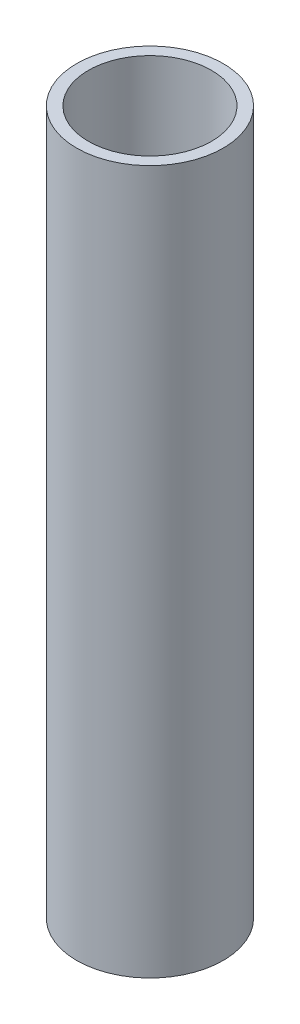
ISO-10303-21;
HEADER;
FILE_DESCRIPTION(('STEP AP214'),'2;1');
FILE_NAME('part.step','',(''),(''),'','','');
FILE_SCHEMA(('AUTOMOTIVE_DESIGN { 1 0 10303 214 1 1 1 1 }'));
ENDSEC;
DATA;
#1=APPLICATION_CONTEXT('core data for automotive mechanical design processes');
#2=APPLICATION_PROTOCOL_DEFINITION('international standard','automotive_design',2000,#1);
#3=PRODUCT_CONTEXT('',#1,'mechanical');
#4=PRODUCT('Part','Part','',(#3));
#5=PRODUCT_RELATED_PRODUCT_CATEGORY('part','',(#4));
#6=PRODUCT_DEFINITION_FORMATION('','',#4);
#7=PRODUCT_DEFINITION_CONTEXT('part definition',#1,'design');
#8=PRODUCT_DEFINITION('design','',#6,#7);
#9=PRODUCT_DEFINITION_SHAPE('','',#8);
#10=(LENGTH_UNIT() NAMED_UNIT(*) SI_UNIT(.MILLI.,.METRE.));
#11=(NAMED_UNIT(*) PLANE_ANGLE_UNIT() SI_UNIT($,.RADIAN.));
#12=(NAMED_UNIT(*) SI_UNIT($,.STERADIAN.) SOLID_ANGLE_UNIT());
#13=UNCERTAINTY_MEASURE_WITH_UNIT(LENGTH_MEASURE(1.E-05),#10,'distance_accuracy_value','');
#14=(GEOMETRIC_REPRESENTATION_CONTEXT(3) GLOBAL_UNCERTAINTY_ASSIGNED_CONTEXT((#13)) GLOBAL_UNIT_ASSIGNED_CONTEXT((#10,
#11,#12)) REPRESENTATION_CONTEXT('',''));
#15=CARTESIAN_POINT('',(0.,0.,0.));
#16=DIRECTION('',(0.,0.,1.));
#17=DIRECTION('',(1.,0.,0.));
#18=AXIS2_PLACEMENT_3D('',#15,#16,#17);
#19=CARTESIAN_POINT('',(0.,120.,0.));
#20=DIRECTION('',(0.,1.,0.));
#21=DIRECTION('',(0.,0.,1.));
#22=AXIS2_PLACEMENT_3D('',#19,#20,#21);
#23=PLANE('',#22);
#24=CARTESIAN_POINT('',(0.,120.,0.));
#25=DIRECTION('',(0.,1.,0.));
#26=DIRECTION('',(0.,0.,1.));
#27=AXIS2_PLACEMENT_3D('',#24,#25,#26);
#28=CIRCLE('',#27,12.5);
#29=CARTESIAN_POINT('',(0.,120.,12.5));
#30=VERTEX_POINT('',#29);
#31=EDGE_CURVE('E11',#30,#30,#28,.T.);
#32=ORIENTED_EDGE('',*,*,#31,.T.);
#33=EDGE_LOOP('',(#32));
#34=FACE_BOUND('',#33,.T.);
#35=CARTESIAN_POINT('',(0.,120.,0.));
#36=DIRECTION('',(0.,1.,0.));
#37=DIRECTION('',(1.,0.,0.));
#38=AXIS2_PLACEMENT_3D('',#35,#36,#37);
#39=CIRCLE('',#38,10.5);
#40=CARTESIAN_POINT('',(10.5,120.,0.));
#41=VERTEX_POINT('',#40);
#42=EDGE_CURVE('E50',#41,#41,#39,.T.);
#43=ORIENTED_EDGE('',*,*,#42,.F.);
#44=EDGE_LOOP('',(#43));
#45=FACE_BOUND('',#44,.T.);
#46=ADVANCED_FACE('F39',(#34,#45),#23,.T.);
#47=CARTESIAN_POINT('',(0.,0.,0.));
#48=DIRECTION('',(0.,1.,0.));
#49=DIRECTION('',(0.,0.,1.));
#50=AXIS2_PLACEMENT_3D('',#47,#48,#49);
#51=PLANE('',#50);
#52=CARTESIAN_POINT('',(0.,0.,0.));
#53=DIRECTION('',(0.,1.,0.));
#54=DIRECTION('',(0.,0.,1.));
#55=AXIS2_PLACEMENT_3D('',#52,#53,#54);
#56=CIRCLE('',#55,12.5);
#57=CARTESIAN_POINT('',(0.,0.,12.5));
#58=VERTEX_POINT('',#57);
#59=EDGE_CURVE('E43',#58,#58,#56,.T.);
#60=ORIENTED_EDGE('',*,*,#59,.F.);
#61=EDGE_LOOP('',(#60));
#62=FACE_BOUND('',#61,.T.);
#63=CARTESIAN_POINT('',(0.,0.,0.));
#64=DIRECTION('',(0.,1.,0.));
#65=DIRECTION('',(1.,0.,0.));
#66=AXIS2_PLACEMENT_3D('',#63,#64,#65);
#67=CIRCLE('',#66,10.5);
#68=CARTESIAN_POINT('',(10.5,0.,0.));
#69=VERTEX_POINT('',#68);
#70=EDGE_CURVE('E52',#69,#69,#67,.T.);
#71=ORIENTED_EDGE('',*,*,#70,.T.);
#72=EDGE_LOOP('',(#71));
#73=FACE_BOUND('',#72,.T.);
#74=ADVANCED_FACE('F62',(#62,#73),#51,.F.);
#75=CARTESIAN_POINT('',(0.,120.,0.));
#76=DIRECTION('',(0.,-1.,0.));
#77=DIRECTION('',(0.,0.,-1.));
#78=AXIS2_PLACEMENT_3D('',#75,#76,#77);
#79=CYLINDRICAL_SURFACE('',#78,12.5);
#80=ORIENTED_EDGE('',*,*,#31,.F.);
#81=EDGE_LOOP('',(#80));
#82=FACE_BOUND('',#81,.T.);
#83=ORIENTED_EDGE('',*,*,#59,.T.);
#84=EDGE_LOOP('',(#83));
#85=FACE_BOUND('',#84,.T.);
#86=ADVANCED_FACE('F41',(#82,#85),#79,.T.);
#87=CARTESIAN_POINT('',(0.,120.,0.));
#88=DIRECTION('',(0.,-1.,0.));
#89=DIRECTION('',(0.,0.,-1.));
#90=AXIS2_PLACEMENT_3D('',#87,#88,#89);
#91=CYLINDRICAL_SURFACE('',#90,10.5);
#92=ORIENTED_EDGE('',*,*,#42,.T.);
#93=EDGE_LOOP('',(#92));
#94=FACE_BOUND('',#93,.T.);
#95=ORIENTED_EDGE('',*,*,#70,.F.);
#96=EDGE_LOOP('',(#95));
#97=FACE_BOUND('',#96,.T.);
#98=ADVANCED_FACE('F58',(#94,#97),#91,.F.);
#99=CLOSED_SHELL('',(#46,#74,#86,#98));
#100=MANIFOLD_SOLID_BREP('B2',#99);
#101=ADVANCED_BREP_SHAPE_REPRESENTATION('',(#18,#100),#14);
#102=SHAPE_DEFINITION_REPRESENTATION(#9,#101);
ENDSEC;
END-ISO-10303-21;
